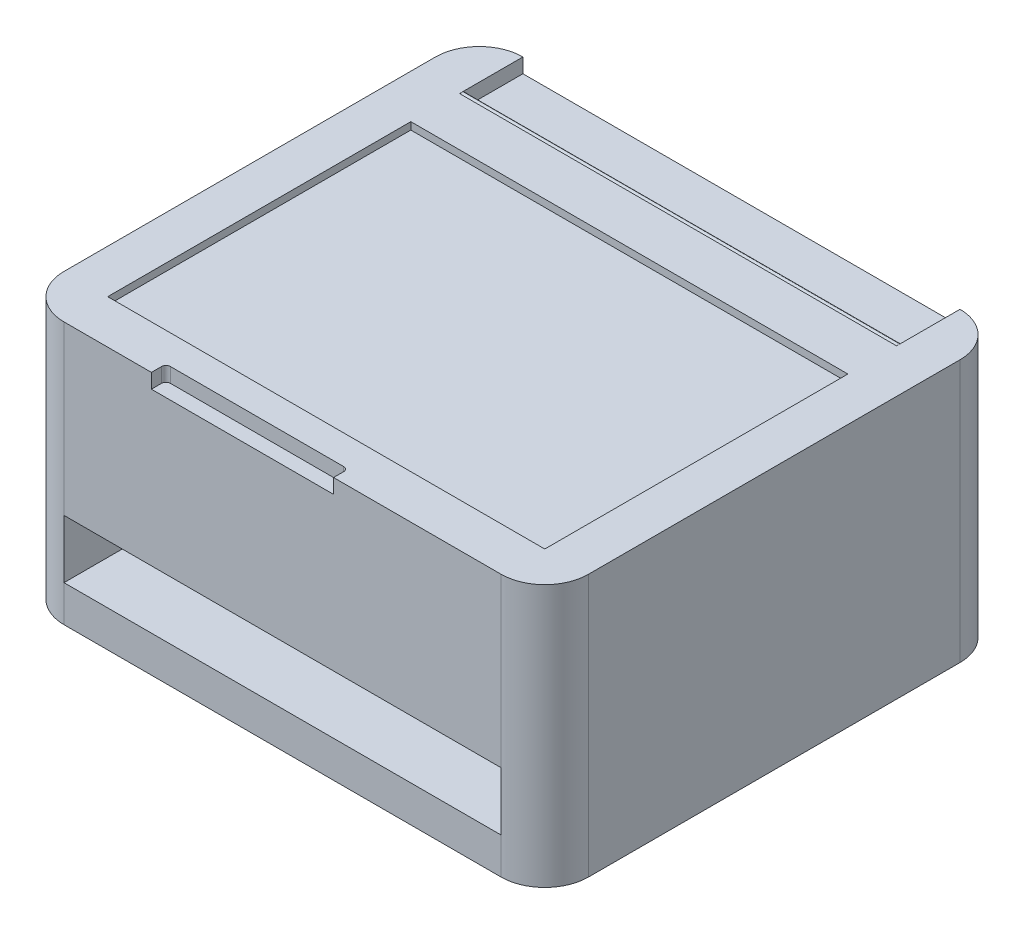
ISO-10303-21;
HEADER;
FILE_DESCRIPTION(('STEP AP214'),'2;1');
FILE_NAME('part.step','',(''),(''),'','','');
FILE_SCHEMA(('AUTOMOTIVE_DESIGN { 1 0 10303 214 1 1 1 1 }'));
ENDSEC;
DATA;
#1=APPLICATION_CONTEXT('core data for automotive mechanical design processes');
#2=APPLICATION_PROTOCOL_DEFINITION('international standard','automotive_design',2000,#1);
#3=PRODUCT_CONTEXT('',#1,'mechanical');
#4=PRODUCT('Part','Part','',(#3));
#5=PRODUCT_RELATED_PRODUCT_CATEGORY('part','',(#4));
#6=PRODUCT_DEFINITION_FORMATION('','',#4);
#7=PRODUCT_DEFINITION_CONTEXT('part definition',#1,'design');
#8=PRODUCT_DEFINITION('design','',#6,#7);
#9=PRODUCT_DEFINITION_SHAPE('','',#8);
#10=(LENGTH_UNIT() NAMED_UNIT(*) SI_UNIT(.MILLI.,.METRE.));
#11=(NAMED_UNIT(*) PLANE_ANGLE_UNIT() SI_UNIT($,.RADIAN.));
#12=(NAMED_UNIT(*) SI_UNIT($,.STERADIAN.) SOLID_ANGLE_UNIT());
#13=UNCERTAINTY_MEASURE_WITH_UNIT(LENGTH_MEASURE(1.E-05),#10,'distance_accuracy_value','');
#14=(GEOMETRIC_REPRESENTATION_CONTEXT(3) GLOBAL_UNCERTAINTY_ASSIGNED_CONTEXT((#13)) GLOBAL_UNIT_ASSIGNED_CONTEXT((#10,
#11,#12)) REPRESENTATION_CONTEXT('',''));
#15=CARTESIAN_POINT('',(0.,0.,0.));
#16=DIRECTION('',(0.,0.,1.));
#17=DIRECTION('',(1.,0.,0.));
#18=AXIS2_PLACEMENT_3D('',#15,#16,#17);
#19=CARTESIAN_POINT('',(150.,-1.76,-115.74));
#20=DIRECTION('',(-1.,0.,0.));
#21=DIRECTION('',(0.,0.,1.));
#22=AXIS2_PLACEMENT_3D('',#19,#20,#21);
#23=CYLINDRICAL_SURFACE('',#22,1.75999999999999);
#24=CARTESIAN_POINT('',(150.,-1.76,-115.74));
#25=DIRECTION('',(1.,0.,0.));
#26=DIRECTION('',(0.,0.,-1.));
#27=AXIS2_PLACEMENT_3D('',#24,#25,#26);
#28=CIRCLE('',#27,1.75999999999999);
#29=CARTESIAN_POINT('',(150.,-1.76,-117.5));
#30=VERTEX_POINT('',#29);
#31=EDGE_CURVE('E11',#30,#30,#28,.T.);
#32=ORIENTED_EDGE('',*,*,#31,.F.);
#33=EDGE_LOOP('',(#32));
#34=FACE_BOUND('',#33,.T.);
#35=CARTESIAN_POINT('',(-150.,-1.76,-115.74));
#36=DIRECTION('',(1.,0.,0.));
#37=DIRECTION('',(0.,0.,-1.));
#38=AXIS2_PLACEMENT_3D('',#35,#36,#37);
#39=CIRCLE('',#38,1.75999999999999);
#40=CARTESIAN_POINT('',(-150.,-1.76,-117.5));
#41=VERTEX_POINT('',#40);
#42=EDGE_CURVE('E53',#41,#41,#39,.T.);
#43=ORIENTED_EDGE('',*,*,#42,.T.);
#44=EDGE_LOOP('',(#43));
#45=FACE_BOUND('',#44,.T.);
#46=ADVANCED_FACE('F50',(#34,#45),#23,.T.);
#47=CARTESIAN_POINT('',(150.,-1.76,-115.74));
#48=DIRECTION('',(1.,0.,0.));
#49=DIRECTION('',(0.,0.,-1.));
#50=AXIS2_PLACEMENT_3D('',#47,#48,#49);
#51=PLANE('',#50);
#52=ORIENTED_EDGE('',*,*,#31,.T.);
#53=EDGE_LOOP('',(#52));
#54=FACE_BOUND('',#53,.T.);
#55=ADVANCED_FACE('F65',(#54),#51,.T.);
#56=CARTESIAN_POINT('',(-150.,-1.76,-115.74));
#57=DIRECTION('',(1.,0.,0.));
#58=DIRECTION('',(0.,0.,-1.));
#59=AXIS2_PLACEMENT_3D('',#56,#57,#58);
#60=PLANE('',#59);
#61=ORIENTED_EDGE('',*,*,#42,.F.);
#62=EDGE_LOOP('',(#61));
#63=FACE_BOUND('',#62,.T.);
#64=ADVANCED_FACE('F63',(#63),#60,.F.);
#65=CLOSED_SHELL('',(#46,#55,#64));
#66=MANIFOLD_SOLID_BREP('B2',#65);
#67=CARTESIAN_POINT('',(180.,-180.,157.5));
#68=DIRECTION('',(0.,0.,1.));
#69=DIRECTION('',(1.,0.,0.));
#70=AXIS2_PLACEMENT_3D('',#67,#68,#69);
#71=PLANE('',#70);
#72=DIRECTION('',(1.,0.,0.));
#73=VECTOR('',#72,1.);
#74=CARTESIAN_POINT('',(-150.,-155.,157.5));
#75=LINE('',#74,#73);
#76=CARTESIAN_POINT('',(-150.,-155.,157.5));
#77=VERTEX_POINT('',#76);
#78=CARTESIAN_POINT('',(150.,-155.,157.5));
#79=VERTEX_POINT('',#78);
#80=EDGE_CURVE('E113',#77,#79,#75,.T.);
#81=ORIENTED_EDGE('',*,*,#80,.F.);
#82=DIRECTION('',(0.,1.,0.));
#83=VECTOR('',#82,1.);
#84=CARTESIAN_POINT('',(-150.,-180.,157.5));
#85=LINE('',#84,#83);
#86=CARTESIAN_POINT('',(-150.,-180.,157.5));
#87=VERTEX_POINT('',#86);
#88=EDGE_CURVE('E465',#77,#87,#85,.F.);
#89=ORIENTED_EDGE('',*,*,#88,.T.);
#90=DIRECTION('',(1.,0.,0.));
#91=VECTOR('',#90,1.);
#92=CARTESIAN_POINT('',(180.,-180.,157.5));
#93=LINE('',#92,#91);
#94=CARTESIAN_POINT('',(150.,-180.,157.5));
#95=VERTEX_POINT('',#94);
#96=EDGE_CURVE('E429',#87,#95,#93,.T.);
#97=ORIENTED_EDGE('',*,*,#96,.T.);
#98=DIRECTION('',(0.,1.,0.));
#99=VECTOR('',#98,1.);
#100=CARTESIAN_POINT('',(150.,-180.,157.5));
#101=LINE('',#100,#99);
#102=EDGE_CURVE('E462',#95,#79,#101,.T.);
#103=ORIENTED_EDGE('',*,*,#102,.T.);
#104=EDGE_LOOP('',(#81,#89,#97,#103));
#105=FACE_BOUND('',#104,.T.);
#106=ADVANCED_FACE('F90',(#105),#71,.T.);
#107=CARTESIAN_POINT('',(-150.,-10.,-117.5));
#108=DIRECTION('',(0.,0.,1.));
#109=DIRECTION('',(1.,0.,0.));
#110=AXIS2_PLACEMENT_3D('',#107,#108,#109);
#111=PLANE('',#110);
#112=DIRECTION('',(-1.,0.,0.));
#113=VECTOR('',#112,1.);
#114=CARTESIAN_POINT('',(-150.,-3.52,-117.5));
#115=LINE('',#114,#113);
#116=CARTESIAN_POINT('',(150.,-3.52,-117.5));
#117=VERTEX_POINT('',#116);
#118=CARTESIAN_POINT('',(-150.,-3.52,-117.5));
#119=VERTEX_POINT('',#118);
#120=EDGE_CURVE('E346',#117,#119,#115,.T.);
#121=ORIENTED_EDGE('',*,*,#120,.F.);
#122=DIRECTION('',(0.,1.,0.));
#123=VECTOR('',#122,1.);
#124=CARTESIAN_POINT('',(150.,-10.,-117.5));
#125=LINE('',#124,#123);
#126=CARTESIAN_POINT('',(150.,-10.,-117.5));
#127=VERTEX_POINT('',#126);
#128=EDGE_CURVE('E418',#127,#117,#125,.T.);
#129=ORIENTED_EDGE('',*,*,#128,.F.);
#130=DIRECTION('',(1.,0.,0.));
#131=VECTOR('',#130,1.);
#132=CARTESIAN_POINT('',(-150.,-10.,-117.5));
#133=LINE('',#132,#131);
#134=CARTESIAN_POINT('',(-150.,-10.,-117.5));
#135=VERTEX_POINT('',#134);
#136=EDGE_CURVE('E409',#135,#127,#133,.T.);
#137=ORIENTED_EDGE('',*,*,#136,.F.);
#138=DIRECTION('',(0.,1.,0.));
#139=VECTOR('',#138,1.);
#140=CARTESIAN_POINT('',(-150.,-10.,-117.5));
#141=LINE('',#140,#139);
#142=EDGE_CURVE('E422',#135,#119,#141,.T.);
#143=ORIENTED_EDGE('',*,*,#142,.T.);
#144=EDGE_LOOP('',(#121,#129,#137,#143));
#145=FACE_BOUND('',#144,.T.);
#146=ADVANCED_FACE('F563',(#145),#111,.F.);
#147=CARTESIAN_POINT('',(180.,-180.,-157.5));
#148=DIRECTION('',(0.,0.,-1.));
#149=DIRECTION('',(-1.,0.,0.));
#150=AXIS2_PLACEMENT_3D('',#147,#148,#149);
#151=PLANE('',#150);
#152=DIRECTION('',(0.,1.,0.));
#153=VECTOR('',#152,1.);
#154=CARTESIAN_POINT('',(-150.,-180.,-157.5));
#155=LINE('',#154,#153);
#156=CARTESIAN_POINT('',(-150.,-180.,-157.5));
#157=VERTEX_POINT('',#156);
#158=CARTESIAN_POINT('',(-150.,-10.,-157.5));
#159=VERTEX_POINT('',#158);
#160=EDGE_CURVE('E480',#157,#159,#155,.T.);
#161=ORIENTED_EDGE('',*,*,#160,.T.);
#162=DIRECTION('',(-1.,0.,0.));
#163=VECTOR('',#162,1.);
#164=CARTESIAN_POINT('',(-150.,-10.,-157.5));
#165=LINE('',#164,#163);
#166=CARTESIAN_POINT('',(150.,-10.,-157.5));
#167=VERTEX_POINT('',#166);
#168=EDGE_CURVE('E402',#167,#159,#165,.T.);
#169=ORIENTED_EDGE('',*,*,#168,.F.);
#170=DIRECTION('',(0.,1.,0.));
#171=VECTOR('',#170,1.);
#172=CARTESIAN_POINT('',(150.,-180.,-157.5));
#173=LINE('',#172,#171);
#174=CARTESIAN_POINT('',(150.,-180.,-157.5));
#175=VERTEX_POINT('',#174);
#176=EDGE_CURVE('E477',#167,#175,#173,.F.);
#177=ORIENTED_EDGE('',*,*,#176,.T.);
#178=DIRECTION('',(-1.,0.,0.));
#179=VECTOR('',#178,1.);
#180=CARTESIAN_POINT('',(180.,-180.,-157.5));
#181=LINE('',#180,#179);
#182=EDGE_CURVE('E436',#175,#157,#181,.T.);
#183=ORIENTED_EDGE('',*,*,#182,.T.);
#184=EDGE_LOOP('',(#161,#169,#177,#183));
#185=FACE_BOUND('',#184,.T.);
#186=ADVANCED_FACE('F524',(#185),#151,.T.);
#187=CARTESIAN_POINT('',(-180.,-180.,157.5));
#188=DIRECTION('',(-1.,0.,0.));
#189=DIRECTION('',(0.,0.,1.));
#190=AXIS2_PLACEMENT_3D('',#187,#188,#189);
#191=PLANE('',#190);
#192=DIRECTION('',(0.,0.,1.));
#193=VECTOR('',#192,1.);
#194=CARTESIAN_POINT('',(-180.,-180.,157.5));
#195=LINE('',#194,#193);
#196=CARTESIAN_POINT('',(-180.,-180.,-127.5));
#197=VERTEX_POINT('',#196);
#198=CARTESIAN_POINT('',(-180.,-180.,127.5));
#199=VERTEX_POINT('',#198);
#200=EDGE_CURVE('E426',#197,#199,#195,.T.);
#201=ORIENTED_EDGE('',*,*,#200,.T.);
#202=DIRECTION('',(0.,1.,0.));
#203=VECTOR('',#202,1.);
#204=CARTESIAN_POINT('',(-180.,-180.,127.5));
#205=LINE('',#204,#203);
#206=CARTESIAN_POINT('',(-180.,0.,127.5));
#207=VERTEX_POINT('',#206);
#208=EDGE_CURVE('E449',#199,#207,#205,.T.);
#209=ORIENTED_EDGE('',*,*,#208,.T.);
#210=DIRECTION('',(0.,0.,1.));
#211=VECTOR('',#210,1.);
#212=CARTESIAN_POINT('',(-180.,0.,157.5));
#213=LINE('',#212,#211);
#214=CARTESIAN_POINT('',(-180.,0.,-127.5));
#215=VERTEX_POINT('',#214);
#216=EDGE_CURVE('E421',#215,#207,#213,.T.);
#217=ORIENTED_EDGE('',*,*,#216,.F.);
#218=DIRECTION('',(0.,1.,0.));
#219=VECTOR('',#218,1.);
#220=CARTESIAN_POINT('',(-180.,-180.,-127.5));
#221=LINE('',#220,#219);
#222=EDGE_CURVE('E439',#215,#197,#221,.F.);
#223=ORIENTED_EDGE('',*,*,#222,.T.);
#224=EDGE_LOOP('',(#201,#209,#217,#223));
#225=FACE_BOUND('',#224,.T.);
#226=ADVANCED_FACE('F510',(#225),#191,.T.);
#227=CARTESIAN_POINT('',(180.,-180.,157.5));
#228=DIRECTION('',(1.,0.,0.));
#229=DIRECTION('',(0.,0.,-1.));
#230=AXIS2_PLACEMENT_3D('',#227,#228,#229);
#231=PLANE('',#230);
#232=DIRECTION('',(0.,0.,-1.));
#233=VECTOR('',#232,1.);
#234=CARTESIAN_POINT('',(180.,-180.,157.5));
#235=LINE('',#234,#233);
#236=CARTESIAN_POINT('',(180.,-180.,127.5));
#237=VERTEX_POINT('',#236);
#238=CARTESIAN_POINT('',(180.,-180.,-127.5));
#239=VERTEX_POINT('',#238);
#240=EDGE_CURVE('E433',#237,#239,#235,.T.);
#241=ORIENTED_EDGE('',*,*,#240,.T.);
#242=DIRECTION('',(0.,1.,0.));
#243=VECTOR('',#242,1.);
#244=CARTESIAN_POINT('',(180.,-180.,-127.5));
#245=LINE('',#244,#243);
#246=CARTESIAN_POINT('',(180.,0.,-127.5));
#247=VERTEX_POINT('',#246);
#248=EDGE_CURVE('E48',#239,#247,#245,.T.);
#249=ORIENTED_EDGE('',*,*,#248,.T.);
#250=DIRECTION('',(0.,0.,-1.));
#251=VECTOR('',#250,1.);
#252=CARTESIAN_POINT('',(180.,0.,157.5));
#253=LINE('',#252,#251);
#254=CARTESIAN_POINT('',(180.,0.,127.5));
#255=VERTEX_POINT('',#254);
#256=EDGE_CURVE('E430',#255,#247,#253,.T.);
#257=ORIENTED_EDGE('',*,*,#256,.F.);
#258=DIRECTION('',(0.,1.,0.));
#259=VECTOR('',#258,1.);
#260=CARTESIAN_POINT('',(180.,-180.,127.5));
#261=LINE('',#260,#259);
#262=EDGE_CURVE('E98',#255,#237,#261,.F.);
#263=ORIENTED_EDGE('',*,*,#262,.T.);
#264=EDGE_LOOP('',(#241,#249,#257,#263));
#265=FACE_BOUND('',#264,.T.);
#266=ADVANCED_FACE('F486',(#265),#231,.T.);
#267=DIRECTION('',(-1.,0.,0.));
#268=VECTOR('',#267,1.);
#269=CARTESIAN_POINT('',(-150.,-115.,157.5));
#270=LINE('',#269,#268);
#271=CARTESIAN_POINT('',(150.,-115.,157.5));
#272=VERTEX_POINT('',#271);
#273=CARTESIAN_POINT('',(-150.,-115.,157.5));
#274=VERTEX_POINT('',#273);
#275=EDGE_CURVE('E325',#272,#274,#270,.T.);
#276=ORIENTED_EDGE('',*,*,#275,.F.);
#277=CARTESIAN_POINT('',(150.,0.,157.5));
#278=VERTEX_POINT('',#277);
#279=EDGE_CURVE('E461',#272,#278,#101,.T.);
#280=ORIENTED_EDGE('',*,*,#279,.T.);
#281=DIRECTION('',(1.,0.,0.));
#282=VECTOR('',#281,1.);
#283=CARTESIAN_POINT('',(180.,0.,157.5));
#284=LINE('',#283,#282);
#285=CARTESIAN_POINT('',(35.0000000000001,0.,157.5));
#286=VERTEX_POINT('',#285);
#287=EDGE_CURVE('E442',#286,#278,#284,.T.);
#288=ORIENTED_EDGE('',*,*,#287,.F.);
#289=DIRECTION('',(0.,1.,0.));
#290=VECTOR('',#289,1.);
#291=CARTESIAN_POINT('',(35.,-10.,157.5));
#292=LINE('',#291,#290);
#293=CARTESIAN_POINT('',(35.,-10.,157.5));
#294=VERTEX_POINT('',#293);
#295=EDGE_CURVE('E376',#294,#286,#292,.T.);
#296=ORIENTED_EDGE('',*,*,#295,.F.);
#297=DIRECTION('',(1.,0.,0.));
#298=VECTOR('',#297,1.);
#299=CARTESIAN_POINT('',(-90.,-10.,157.5));
#300=LINE('',#299,#298);
#301=CARTESIAN_POINT('',(-90.,-10.,157.5));
#302=VERTEX_POINT('',#301);
#303=EDGE_CURVE('E357',#302,#294,#300,.T.);
#304=ORIENTED_EDGE('',*,*,#303,.F.);
#305=DIRECTION('',(0.,1.,0.));
#306=VECTOR('',#305,1.);
#307=CARTESIAN_POINT('',(-90.,-10.,157.5));
#308=LINE('',#307,#306);
#309=CARTESIAN_POINT('',(-90.,0.,157.5));
#310=VERTEX_POINT('',#309);
#311=EDGE_CURVE('E389',#302,#310,#308,.T.);
#312=ORIENTED_EDGE('',*,*,#311,.T.);
#313=CARTESIAN_POINT('',(-150.,0.,157.5));
#314=VERTEX_POINT('',#313);
#315=EDGE_CURVE('E443',#314,#310,#284,.T.);
#316=ORIENTED_EDGE('',*,*,#315,.F.);
#317=EDGE_CURVE('E466',#314,#274,#85,.F.);
#318=ORIENTED_EDGE('',*,*,#317,.T.);
#319=EDGE_LOOP('',(#276,#280,#288,#296,#304,#312,#316,#318));
#320=FACE_BOUND('',#319,.T.);
#321=ADVANCED_FACE('F535',(#320),#71,.T.);
#322=CARTESIAN_POINT('',(0.,-180.,0.));
#323=DIRECTION('',(0.,1.,0.));
#324=DIRECTION('',(0.,0.,1.));
#325=AXIS2_PLACEMENT_3D('',#322,#323,#324);
#326=PLANE('',#325);
#327=ORIENTED_EDGE('',*,*,#96,.F.);
#328=CARTESIAN_POINT('',(-150.,-180.,127.5));
#329=DIRECTION('',(0.,1.,0.));
#330=DIRECTION('',(0.,0.,1.));
#331=AXIS2_PLACEMENT_3D('',#328,#329,#330);
#332=CIRCLE('',#331,30.);
#333=EDGE_CURVE('E475',#87,#199,#332,.F.);
#334=ORIENTED_EDGE('',*,*,#333,.T.);
#335=ORIENTED_EDGE('',*,*,#200,.F.);
#336=CARTESIAN_POINT('',(-150.,-180.,-127.5));
#337=DIRECTION('',(0.,1.,0.));
#338=DIRECTION('',(0.,0.,1.));
#339=AXIS2_PLACEMENT_3D('',#336,#337,#338);
#340=CIRCLE('',#339,30.);
#341=EDGE_CURVE('E473',#197,#157,#340,.F.);
#342=ORIENTED_EDGE('',*,*,#341,.T.);
#343=ORIENTED_EDGE('',*,*,#182,.F.);
#344=CARTESIAN_POINT('',(150.,-180.,-127.5));
#345=DIRECTION('',(0.,1.,0.));
#346=DIRECTION('',(0.,0.,1.));
#347=AXIS2_PLACEMENT_3D('',#344,#345,#346);
#348=CIRCLE('',#347,30.);
#349=EDGE_CURVE('E471',#175,#239,#348,.F.);
#350=ORIENTED_EDGE('',*,*,#349,.T.);
#351=ORIENTED_EDGE('',*,*,#240,.F.);
#352=CARTESIAN_POINT('',(150.,-180.,127.5));
#353=DIRECTION('',(0.,1.,0.));
#354=DIRECTION('',(0.,0.,1.));
#355=AXIS2_PLACEMENT_3D('',#352,#353,#354);
#356=CIRCLE('',#355,30.);
#357=EDGE_CURVE('E469',#237,#95,#356,.F.);
#358=ORIENTED_EDGE('',*,*,#357,.T.);
#359=EDGE_LOOP('',(#327,#334,#335,#342,#343,#350,#351,#358));
#360=FACE_BOUND('',#359,.T.);
#361=ADVANCED_FACE('F493',(#360),#326,.F.);
#362=CARTESIAN_POINT('',(0.,0.,0.));
#363=DIRECTION('',(0.,1.,0.));
#364=DIRECTION('',(0.,0.,1.));
#365=AXIS2_PLACEMENT_3D('',#362,#363,#364);
#366=PLANE('',#365);
#367=DIRECTION('',(-1.,0.,0.));
#368=VECTOR('',#367,1.);
#369=CARTESIAN_POINT('',(150.,0.,-80.5482054413467));
#370=LINE('',#369,#368);
#371=CARTESIAN_POINT('',(150.,0.,-80.5482054413467));
#372=VERTEX_POINT('',#371);
#373=CARTESIAN_POINT('',(-150.,0.,-80.5482054413467));
#374=VERTEX_POINT('',#373);
#375=EDGE_CURVE('E105',#372,#374,#370,.T.);
#376=ORIENTED_EDGE('',*,*,#375,.F.);
#377=DIRECTION('',(0.,0.,-1.));
#378=VECTOR('',#377,1.);
#379=CARTESIAN_POINT('',(150.,0.,127.5));
#380=LINE('',#379,#378);
#381=CARTESIAN_POINT('',(150.,0.,127.5));
#382=VERTEX_POINT('',#381);
#383=EDGE_CURVE('E289',#382,#372,#380,.T.);
#384=ORIENTED_EDGE('',*,*,#383,.F.);
#385=DIRECTION('',(1.,0.,0.));
#386=VECTOR('',#385,1.);
#387=CARTESIAN_POINT('',(-150.,0.,127.5));
#388=LINE('',#387,#386);
#389=CARTESIAN_POINT('',(-150.,0.,127.5));
#390=VERTEX_POINT('',#389);
#391=EDGE_CURVE('E292',#390,#382,#388,.T.);
#392=ORIENTED_EDGE('',*,*,#391,.F.);
#393=DIRECTION('',(0.,0.,1.));
#394=VECTOR('',#393,1.);
#395=CARTESIAN_POINT('',(-150.,0.,-80.5482054413467));
#396=LINE('',#395,#394);
#397=EDGE_CURVE('E298',#374,#390,#396,.T.);
#398=ORIENTED_EDGE('',*,*,#397,.F.);
#399=EDGE_LOOP('',(#376,#384,#392,#398));
#400=FACE_BOUND('',#399,.T.);
#401=DIRECTION('',(1.,0.,0.));
#402=VECTOR('',#401,1.);
#403=CARTESIAN_POINT('',(-150.,0.,-113.98));
#404=LINE('',#403,#402);
#405=CARTESIAN_POINT('',(-150.,0.,-113.98));
#406=VERTEX_POINT('',#405);
#407=CARTESIAN_POINT('',(150.,0.,-113.98));
#408=VERTEX_POINT('',#407);
#409=EDGE_CURVE('E332',#406,#408,#404,.T.);
#410=ORIENTED_EDGE('',*,*,#409,.F.);
#411=DIRECTION('',(0.,0.,1.));
#412=VECTOR('',#411,1.);
#413=CARTESIAN_POINT('',(-150.,0.,-157.5));
#414=LINE('',#413,#412);
#415=CARTESIAN_POINT('',(-150.,0.,-157.5));
#416=VERTEX_POINT('',#415);
#417=EDGE_CURVE('E392',#416,#406,#414,.T.);
#418=ORIENTED_EDGE('',*,*,#417,.F.);
#419=CARTESIAN_POINT('',(-150.,0.,-127.5));
#420=DIRECTION('',(0.,1.,0.));
#421=DIRECTION('',(0.,0.,1.));
#422=AXIS2_PLACEMENT_3D('',#419,#420,#421);
#423=CIRCLE('',#422,30.);
#424=EDGE_CURVE('E457',#416,#215,#423,.T.);
#425=ORIENTED_EDGE('',*,*,#424,.T.);
#426=ORIENTED_EDGE('',*,*,#216,.T.);
#427=CARTESIAN_POINT('',(-150.,0.,127.5));
#428=DIRECTION('',(0.,1.,0.));
#429=DIRECTION('',(0.,0.,1.));
#430=AXIS2_PLACEMENT_3D('',#427,#428,#429);
#431=CIRCLE('',#430,30.);
#432=EDGE_CURVE('E459',#207,#314,#431,.T.);
#433=ORIENTED_EDGE('',*,*,#432,.T.);
#434=ORIENTED_EDGE('',*,*,#315,.T.);
#435=DIRECTION('',(0.,0.,1.));
#436=VECTOR('',#435,1.);
#437=CARTESIAN_POINT('',(-90.,0.,157.5));
#438=LINE('',#437,#436);
#439=CARTESIAN_POINT('',(-90.,0.,150.5));
#440=VERTEX_POINT('',#439);
#441=EDGE_CURVE('E361',#440,#310,#438,.T.);
#442=ORIENTED_EDGE('',*,*,#441,.F.);
#443=CARTESIAN_POINT('',(-87.,0.,150.5));
#444=DIRECTION('',(0.,1.,0.));
#445=DIRECTION('',(0.,0.,-1.));
#446=AXIS2_PLACEMENT_3D('',#443,#444,#445);
#447=CIRCLE('',#446,3.);
#448=CARTESIAN_POINT('',(-87.,0.,147.5));
#449=VERTEX_POINT('',#448);
#450=EDGE_CURVE('E385',#449,#440,#447,.T.);
#451=ORIENTED_EDGE('',*,*,#450,.F.);
#452=DIRECTION('',(-1.,0.,0.));
#453=VECTOR('',#452,1.);
#454=CARTESIAN_POINT('',(-87.,0.,147.5));
#455=LINE('',#454,#453);
#456=CARTESIAN_POINT('',(32.,0.,147.5));
#457=VERTEX_POINT('',#456);
#458=EDGE_CURVE('E382',#457,#449,#455,.T.);
#459=ORIENTED_EDGE('',*,*,#458,.F.);
#460=CARTESIAN_POINT('',(32.,0.,150.5));
#461=DIRECTION('',(0.,1.,0.));
#462=DIRECTION('',(0.,0.,-1.));
#463=AXIS2_PLACEMENT_3D('',#460,#461,#462);
#464=CIRCLE('',#463,3.);
#465=CARTESIAN_POINT('',(35.,0.,150.5));
#466=VERTEX_POINT('',#465);
#467=EDGE_CURVE('E379',#466,#457,#464,.T.);
#468=ORIENTED_EDGE('',*,*,#467,.F.);
#469=DIRECTION('',(0.,0.,-1.));
#470=VECTOR('',#469,1.);
#471=CARTESIAN_POINT('',(35.,0.,150.5));
#472=LINE('',#471,#470);
#473=EDGE_CURVE('E354',#286,#466,#472,.T.);
#474=ORIENTED_EDGE('',*,*,#473,.F.);
#475=ORIENTED_EDGE('',*,*,#287,.T.);
#476=CARTESIAN_POINT('',(150.,0.,127.5));
#477=DIRECTION('',(0.,1.,0.));
#478=DIRECTION('',(0.,0.,1.));
#479=AXIS2_PLACEMENT_3D('',#476,#477,#478);
#480=CIRCLE('',#479,30.);
#481=EDGE_CURVE('E452',#278,#255,#480,.T.);
#482=ORIENTED_EDGE('',*,*,#481,.T.);
#483=ORIENTED_EDGE('',*,*,#256,.T.);
#484=CARTESIAN_POINT('',(150.,0.,-127.5));
#485=DIRECTION('',(0.,1.,0.));
#486=DIRECTION('',(0.,0.,1.));
#487=AXIS2_PLACEMENT_3D('',#484,#485,#486);
#488=CIRCLE('',#487,30.);
#489=CARTESIAN_POINT('',(150.,0.,-157.5));
#490=VERTEX_POINT('',#489);
#491=EDGE_CURVE('E454',#247,#490,#488,.T.);
#492=ORIENTED_EDGE('',*,*,#491,.T.);
#493=DIRECTION('',(0.,0.,-1.));
#494=VECTOR('',#493,1.);
#495=CARTESIAN_POINT('',(150.,0.,-117.5));
#496=LINE('',#495,#494);
#497=EDGE_CURVE('E406',#408,#490,#496,.T.);
#498=ORIENTED_EDGE('',*,*,#497,.F.);
#499=EDGE_LOOP('',(#410,#418,#425,#426,#433,#434,#442,#451,#459,#468,#474,#475,#482,#483,#492,#498));
#500=FACE_BOUND('',#499,.T.);
#501=ADVANCED_FACE('F514',(#400,#500),#366,.T.);
#502=CARTESIAN_POINT('',(-150.,-180.,127.5));
#503=DIRECTION('',(0.,1.,0.));
#504=DIRECTION('',(0.,0.,1.));
#505=AXIS2_PLACEMENT_3D('',#502,#503,#504);
#506=CYLINDRICAL_SURFACE('',#505,30.);
#507=ORIENTED_EDGE('',*,*,#333,.F.);
#508=ORIENTED_EDGE('',*,*,#88,.F.);
#509=DIRECTION('',(0.,-1.,0.));
#510=VECTOR('',#509,1.);
#511=CARTESIAN_POINT('',(-150.,-155.,157.5));
#512=LINE('',#511,#510);
#513=EDGE_CURVE('E311',#274,#77,#512,.T.);
#514=ORIENTED_EDGE('',*,*,#513,.F.);
#515=ORIENTED_EDGE('',*,*,#317,.F.);
#516=ORIENTED_EDGE('',*,*,#432,.F.);
#517=ORIENTED_EDGE('',*,*,#208,.F.);
#518=EDGE_LOOP('',(#507,#508,#514,#515,#516,#517));
#519=FACE_BOUND('',#518,.T.);
#520=ADVANCED_FACE('F505',(#519),#506,.T.);
#521=CARTESIAN_POINT('',(-150.,-180.,-127.5));
#522=DIRECTION('',(0.,1.,0.));
#523=DIRECTION('',(0.,0.,1.));
#524=AXIS2_PLACEMENT_3D('',#521,#522,#523);
#525=CYLINDRICAL_SURFACE('',#524,30.);
#526=ORIENTED_EDGE('',*,*,#341,.F.);
#527=ORIENTED_EDGE('',*,*,#222,.F.);
#528=ORIENTED_EDGE('',*,*,#424,.F.);
#529=DIRECTION('',(0.,1.,0.));
#530=VECTOR('',#529,1.);
#531=CARTESIAN_POINT('',(-150.,-10.,-157.5));
#532=LINE('',#531,#530);
#533=EDGE_CURVE('E415',#159,#416,#532,.T.);
#534=ORIENTED_EDGE('',*,*,#533,.F.);
#535=ORIENTED_EDGE('',*,*,#160,.F.);
#536=EDGE_LOOP('',(#526,#527,#528,#534,#535));
#537=FACE_BOUND('',#536,.T.);
#538=ADVANCED_FACE('F521',(#537),#525,.T.);
#539=CARTESIAN_POINT('',(150.,-180.,-127.5));
#540=DIRECTION('',(0.,1.,0.));
#541=DIRECTION('',(0.,0.,1.));
#542=AXIS2_PLACEMENT_3D('',#539,#540,#541);
#543=CYLINDRICAL_SURFACE('',#542,30.);
#544=ORIENTED_EDGE('',*,*,#349,.F.);
#545=ORIENTED_EDGE('',*,*,#176,.F.);
#546=EDGE_CURVE('E478',#490,#167,#173,.F.);
#547=ORIENTED_EDGE('',*,*,#546,.F.);
#548=ORIENTED_EDGE('',*,*,#491,.F.);
#549=ORIENTED_EDGE('',*,*,#248,.F.);
#550=EDGE_LOOP('',(#544,#545,#547,#548,#549));
#551=FACE_BOUND('',#550,.T.);
#552=ADVANCED_FACE('F529',(#551),#543,.T.);
#553=CARTESIAN_POINT('',(150.,-180.,127.5));
#554=DIRECTION('',(0.,1.,0.));
#555=DIRECTION('',(0.,0.,1.));
#556=AXIS2_PLACEMENT_3D('',#553,#554,#555);
#557=CYLINDRICAL_SURFACE('',#556,30.);
#558=ORIENTED_EDGE('',*,*,#357,.F.);
#559=ORIENTED_EDGE('',*,*,#262,.F.);
#560=ORIENTED_EDGE('',*,*,#481,.F.);
#561=ORIENTED_EDGE('',*,*,#279,.F.);
#562=DIRECTION('',(0.,1.,0.));
#563=VECTOR('',#562,1.);
#564=CARTESIAN_POINT('',(150.,-155.,157.5));
#565=LINE('',#564,#563);
#566=EDGE_CURVE('E322',#79,#272,#565,.T.);
#567=ORIENTED_EDGE('',*,*,#566,.F.);
#568=ORIENTED_EDGE('',*,*,#102,.F.);
#569=EDGE_LOOP('',(#558,#559,#560,#561,#567,#568));
#570=FACE_BOUND('',#569,.T.);
#571=ADVANCED_FACE('F92',(#570),#557,.T.);
#572=CARTESIAN_POINT('',(150.,-10.,-117.5));
#573=DIRECTION('',(1.,0.,0.));
#574=DIRECTION('',(0.,0.,-1.));
#575=AXIS2_PLACEMENT_3D('',#572,#573,#574);
#576=PLANE('',#575);
#577=ORIENTED_EDGE('',*,*,#497,.T.);
#578=ORIENTED_EDGE('',*,*,#546,.T.);
#579=DIRECTION('',(0.,0.,-1.));
#580=VECTOR('',#579,1.);
#581=CARTESIAN_POINT('',(150.,-10.,-117.5));
#582=LINE('',#581,#580);
#583=EDGE_CURVE('E412',#127,#167,#582,.T.);
#584=ORIENTED_EDGE('',*,*,#583,.F.);
#585=ORIENTED_EDGE('',*,*,#128,.T.);
#586=DIRECTION('',(0.,0.,-1.));
#587=VECTOR('',#586,1.);
#588=CARTESIAN_POINT('',(150.,-3.52,-117.5));
#589=LINE('',#588,#587);
#590=CARTESIAN_POINT('',(150.,-3.52,-113.98));
#591=VERTEX_POINT('',#590);
#592=EDGE_CURVE('E344',#591,#117,#589,.T.);
#593=ORIENTED_EDGE('',*,*,#592,.F.);
#594=DIRECTION('',(0.,1.,0.));
#595=VECTOR('',#594,1.);
#596=CARTESIAN_POINT('',(150.,-3.52,-113.98));
#597=LINE('',#596,#595);
#598=EDGE_CURVE('E351',#591,#408,#597,.T.);
#599=ORIENTED_EDGE('',*,*,#598,.T.);
#600=EDGE_LOOP('',(#577,#578,#584,#585,#593,#599));
#601=FACE_BOUND('',#600,.T.);
#602=ADVANCED_FACE('F590',(#601),#576,.F.);
#603=CARTESIAN_POINT('',(-150.,-10.,-157.5));
#604=DIRECTION('',(-1.,0.,0.));
#605=DIRECTION('',(0.,0.,1.));
#606=AXIS2_PLACEMENT_3D('',#603,#604,#605);
#607=PLANE('',#606);
#608=ORIENTED_EDGE('',*,*,#417,.T.);
#609=DIRECTION('',(0.,1.,0.));
#610=VECTOR('',#609,1.);
#611=CARTESIAN_POINT('',(-150.,-3.52,-113.98));
#612=LINE('',#611,#610);
#613=CARTESIAN_POINT('',(-150.,-3.52,-113.98));
#614=VERTEX_POINT('',#613);
#615=EDGE_CURVE('E348',#614,#406,#612,.T.);
#616=ORIENTED_EDGE('',*,*,#615,.F.);
#617=DIRECTION('',(0.,0.,1.));
#618=VECTOR('',#617,1.);
#619=CARTESIAN_POINT('',(-150.,-3.52,-117.5));
#620=LINE('',#619,#618);
#621=EDGE_CURVE('E338',#119,#614,#620,.T.);
#622=ORIENTED_EDGE('',*,*,#621,.F.);
#623=ORIENTED_EDGE('',*,*,#142,.F.);
#624=DIRECTION('',(0.,0.,1.));
#625=VECTOR('',#624,1.);
#626=CARTESIAN_POINT('',(-150.,-10.,-157.5));
#627=LINE('',#626,#625);
#628=EDGE_CURVE('E405',#159,#135,#627,.T.);
#629=ORIENTED_EDGE('',*,*,#628,.F.);
#630=ORIENTED_EDGE('',*,*,#533,.T.);
#631=EDGE_LOOP('',(#608,#616,#622,#623,#629,#630));
#632=FACE_BOUND('',#631,.T.);
#633=ADVANCED_FACE('F587',(#632),#607,.F.);
#634=CARTESIAN_POINT('',(0.,-10.,0.));
#635=DIRECTION('',(0.,1.,0.));
#636=DIRECTION('',(0.,0.,1.));
#637=AXIS2_PLACEMENT_3D('',#634,#635,#636);
#638=PLANE('',#637);
#639=ORIENTED_EDGE('',*,*,#168,.T.);
#640=ORIENTED_EDGE('',*,*,#628,.T.);
#641=ORIENTED_EDGE('',*,*,#136,.T.);
#642=ORIENTED_EDGE('',*,*,#583,.T.);
#643=EDGE_LOOP('',(#639,#640,#641,#642));
#644=FACE_BOUND('',#643,.T.);
#645=ADVANCED_FACE('F589',(#644),#638,.T.);
#646=CARTESIAN_POINT('',(-90.,-10.,157.5));
#647=DIRECTION('',(-1.,0.,0.));
#648=DIRECTION('',(0.,0.,1.));
#649=AXIS2_PLACEMENT_3D('',#646,#647,#648);
#650=PLANE('',#649);
#651=ORIENTED_EDGE('',*,*,#441,.T.);
#652=ORIENTED_EDGE('',*,*,#311,.F.);
#653=DIRECTION('',(0.,0.,1.));
#654=VECTOR('',#653,1.);
#655=CARTESIAN_POINT('',(-90.,-10.,157.5));
#656=LINE('',#655,#654);
#657=CARTESIAN_POINT('',(-90.,-10.,150.5));
#658=VERTEX_POINT('',#657);
#659=EDGE_CURVE('E373',#658,#302,#656,.T.);
#660=ORIENTED_EDGE('',*,*,#659,.F.);
#661=DIRECTION('',(0.,1.,0.));
#662=VECTOR('',#661,1.);
#663=CARTESIAN_POINT('',(-90.,-10.,150.5));
#664=LINE('',#663,#662);
#665=EDGE_CURVE('E393',#658,#440,#664,.T.);
#666=ORIENTED_EDGE('',*,*,#665,.T.);
#667=EDGE_LOOP('',(#651,#652,#660,#666));
#668=FACE_BOUND('',#667,.T.);
#669=ADVANCED_FACE('F598',(#668),#650,.F.);
#670=CARTESIAN_POINT('',(-87.,-10.,150.5));
#671=DIRECTION('',(0.,1.,0.));
#672=DIRECTION('',(0.,0.,1.));
#673=AXIS2_PLACEMENT_3D('',#670,#671,#672);
#674=CYLINDRICAL_SURFACE('',#673,3.);
#675=ORIENTED_EDGE('',*,*,#450,.T.);
#676=ORIENTED_EDGE('',*,*,#665,.F.);
#677=CARTESIAN_POINT('',(-87.,-10.,150.5));
#678=DIRECTION('',(0.,1.,0.));
#679=DIRECTION('',(0.,0.,-1.));
#680=AXIS2_PLACEMENT_3D('',#677,#678,#679);
#681=CIRCLE('',#680,3.);
#682=CARTESIAN_POINT('',(-87.,-10.,147.5));
#683=VERTEX_POINT('',#682);
#684=EDGE_CURVE('E370',#683,#658,#681,.T.);
#685=ORIENTED_EDGE('',*,*,#684,.F.);
#686=DIRECTION('',(0.,1.,0.));
#687=VECTOR('',#686,1.);
#688=CARTESIAN_POINT('',(-87.,-10.,147.5));
#689=LINE('',#688,#687);
#690=EDGE_CURVE('E395',#683,#449,#689,.T.);
#691=ORIENTED_EDGE('',*,*,#690,.T.);
#692=EDGE_LOOP('',(#675,#676,#685,#691));
#693=FACE_BOUND('',#692,.T.);
#694=ADVANCED_FACE('F612',(#693),#674,.F.);
#695=CARTESIAN_POINT('',(-87.,-10.,147.5));
#696=DIRECTION('',(0.,0.,-1.));
#697=DIRECTION('',(-1.,0.,0.));
#698=AXIS2_PLACEMENT_3D('',#695,#696,#697);
#699=PLANE('',#698);
#700=ORIENTED_EDGE('',*,*,#458,.T.);
#701=ORIENTED_EDGE('',*,*,#690,.F.);
#702=DIRECTION('',(-1.,0.,0.));
#703=VECTOR('',#702,1.);
#704=CARTESIAN_POINT('',(-87.,-10.,147.5));
#705=LINE('',#704,#703);
#706=CARTESIAN_POINT('',(32.,-10.,147.5));
#707=VERTEX_POINT('',#706);
#708=EDGE_CURVE('E367',#707,#683,#705,.T.);
#709=ORIENTED_EDGE('',*,*,#708,.F.);
#710=DIRECTION('',(0.,1.,0.));
#711=VECTOR('',#710,1.);
#712=CARTESIAN_POINT('',(32.,-10.,147.5));
#713=LINE('',#712,#711);
#714=EDGE_CURVE('E397',#707,#457,#713,.T.);
#715=ORIENTED_EDGE('',*,*,#714,.T.);
#716=EDGE_LOOP('',(#700,#701,#709,#715));
#717=FACE_BOUND('',#716,.T.);
#718=ADVANCED_FACE('F608',(#717),#699,.F.);
#719=CARTESIAN_POINT('',(32.,-10.,150.5));
#720=DIRECTION('',(0.,1.,0.));
#721=DIRECTION('',(0.,0.,1.));
#722=AXIS2_PLACEMENT_3D('',#719,#720,#721);
#723=CYLINDRICAL_SURFACE('',#722,3.);
#724=ORIENTED_EDGE('',*,*,#467,.T.);
#725=ORIENTED_EDGE('',*,*,#714,.F.);
#726=CARTESIAN_POINT('',(32.,-10.,150.5));
#727=DIRECTION('',(0.,1.,0.));
#728=DIRECTION('',(0.,0.,-1.));
#729=AXIS2_PLACEMENT_3D('',#726,#727,#728);
#730=CIRCLE('',#729,3.);
#731=CARTESIAN_POINT('',(35.,-10.,150.5));
#732=VERTEX_POINT('',#731);
#733=EDGE_CURVE('E364',#732,#707,#730,.T.);
#734=ORIENTED_EDGE('',*,*,#733,.F.);
#735=DIRECTION('',(0.,1.,0.));
#736=VECTOR('',#735,1.);
#737=CARTESIAN_POINT('',(35.,-10.,150.5));
#738=LINE('',#737,#736);
#739=EDGE_CURVE('E399',#732,#466,#738,.T.);
#740=ORIENTED_EDGE('',*,*,#739,.T.);
#741=EDGE_LOOP('',(#724,#725,#734,#740));
#742=FACE_BOUND('',#741,.T.);
#743=ADVANCED_FACE('F604',(#742),#723,.F.);
#744=CARTESIAN_POINT('',(35.,-10.,150.5));
#745=DIRECTION('',(1.,0.,0.));
#746=DIRECTION('',(0.,0.,-1.));
#747=AXIS2_PLACEMENT_3D('',#744,#745,#746);
#748=PLANE('',#747);
#749=ORIENTED_EDGE('',*,*,#473,.T.);
#750=ORIENTED_EDGE('',*,*,#739,.F.);
#751=DIRECTION('',(0.,0.,-1.));
#752=VECTOR('',#751,1.);
#753=CARTESIAN_POINT('',(35.,-10.,150.5));
#754=LINE('',#753,#752);
#755=EDGE_CURVE('E360',#294,#732,#754,.T.);
#756=ORIENTED_EDGE('',*,*,#755,.F.);
#757=ORIENTED_EDGE('',*,*,#295,.T.);
#758=EDGE_LOOP('',(#749,#750,#756,#757));
#759=FACE_BOUND('',#758,.T.);
#760=ADVANCED_FACE('F600',(#759),#748,.F.);
#761=CARTESIAN_POINT('',(32.,-10.,150.5));
#762=DIRECTION('',(0.,-1.,0.));
#763=DIRECTION('',(0.,0.,-1.));
#764=AXIS2_PLACEMENT_3D('',#761,#762,#763);
#765=PLANE('',#764);
#766=ORIENTED_EDGE('',*,*,#303,.T.);
#767=ORIENTED_EDGE('',*,*,#755,.T.);
#768=ORIENTED_EDGE('',*,*,#733,.T.);
#769=ORIENTED_EDGE('',*,*,#708,.T.);
#770=ORIENTED_EDGE('',*,*,#684,.T.);
#771=ORIENTED_EDGE('',*,*,#659,.T.);
#772=EDGE_LOOP('',(#766,#767,#768,#769,#770,#771));
#773=FACE_BOUND('',#772,.T.);
#774=ADVANCED_FACE('F603',(#773),#765,.F.);
#775=CARTESIAN_POINT('',(-150.,-3.52,-113.98));
#776=DIRECTION('',(0.,0.,1.));
#777=DIRECTION('',(1.,0.,0.));
#778=AXIS2_PLACEMENT_3D('',#775,#776,#777);
#779=PLANE('',#778);
#780=ORIENTED_EDGE('',*,*,#409,.T.);
#781=ORIENTED_EDGE('',*,*,#598,.F.);
#782=DIRECTION('',(1.,0.,0.));
#783=VECTOR('',#782,1.);
#784=CARTESIAN_POINT('',(-150.,-3.52,-113.98));
#785=LINE('',#784,#783);
#786=EDGE_CURVE('E341',#614,#591,#785,.T.);
#787=ORIENTED_EDGE('',*,*,#786,.F.);
#788=ORIENTED_EDGE('',*,*,#615,.T.);
#789=EDGE_LOOP('',(#780,#781,#787,#788));
#790=FACE_BOUND('',#789,.T.);
#791=ADVANCED_FACE('F558',(#790),#779,.F.);
#792=CARTESIAN_POINT('',(0.,-3.52,0.));
#793=DIRECTION('',(0.,1.,0.));
#794=DIRECTION('',(0.,0.,1.));
#795=AXIS2_PLACEMENT_3D('',#792,#793,#794);
#796=PLANE('',#795);
#797=ORIENTED_EDGE('',*,*,#621,.T.);
#798=ORIENTED_EDGE('',*,*,#786,.T.);
#799=ORIENTED_EDGE('',*,*,#592,.T.);
#800=ORIENTED_EDGE('',*,*,#120,.T.);
#801=EDGE_LOOP('',(#797,#798,#799,#800));
#802=FACE_BOUND('',#801,.T.);
#803=ADVANCED_FACE('F551',(#802),#796,.T.);
#804=CARTESIAN_POINT('',(-150.,-155.,7.50000000000001));
#805=DIRECTION('',(0.,-1.,0.));
#806=DIRECTION('',(0.,0.,-1.));
#807=AXIS2_PLACEMENT_3D('',#804,#805,#806);
#808=PLANE('',#807);
#809=ORIENTED_EDGE('',*,*,#80,.T.);
#810=DIRECTION('',(0.,0.,1.));
#811=VECTOR('',#810,1.);
#812=CARTESIAN_POINT('',(150.,-155.,7.50000000000001));
#813=LINE('',#812,#811);
#814=CARTESIAN_POINT('',(150.,-155.,7.50000000000001));
#815=VERTEX_POINT('',#814);
#816=EDGE_CURVE('E320',#815,#79,#813,.T.);
#817=ORIENTED_EDGE('',*,*,#816,.F.);
#818=DIRECTION('',(1.,0.,0.));
#819=VECTOR('',#818,1.);
#820=CARTESIAN_POINT('',(-150.,-155.,7.50000000000001));
#821=LINE('',#820,#819);
#822=CARTESIAN_POINT('',(-150.,-155.,7.50000000000001));
#823=VERTEX_POINT('',#822);
#824=EDGE_CURVE('E307',#823,#815,#821,.T.);
#825=ORIENTED_EDGE('',*,*,#824,.F.);
#826=DIRECTION('',(0.,0.,1.));
#827=VECTOR('',#826,1.);
#828=CARTESIAN_POINT('',(-150.,-155.,7.50000000000001));
#829=LINE('',#828,#827);
#830=EDGE_CURVE('E330',#823,#77,#829,.T.);
#831=ORIENTED_EDGE('',*,*,#830,.T.);
#832=EDGE_LOOP('',(#809,#817,#825,#831));
#833=FACE_BOUND('',#832,.T.);
#834=ADVANCED_FACE('F549',(#833),#808,.F.);
#835=CARTESIAN_POINT('',(-150.,-155.,7.50000000000001));
#836=DIRECTION('',(-1.,0.,0.));
#837=DIRECTION('',(0.,0.,1.));
#838=AXIS2_PLACEMENT_3D('',#835,#836,#837);
#839=PLANE('',#838);
#840=ORIENTED_EDGE('',*,*,#513,.T.);
#841=ORIENTED_EDGE('',*,*,#830,.F.);
#842=DIRECTION('',(0.,-1.,0.));
#843=VECTOR('',#842,1.);
#844=CARTESIAN_POINT('',(-150.,-155.,7.50000000000001));
#845=LINE('',#844,#843);
#846=CARTESIAN_POINT('',(-150.,-115.,7.50000000000001));
#847=VERTEX_POINT('',#846);
#848=EDGE_CURVE('E317',#847,#823,#845,.T.);
#849=ORIENTED_EDGE('',*,*,#848,.F.);
#850=DIRECTION('',(0.,0.,1.));
#851=VECTOR('',#850,1.);
#852=CARTESIAN_POINT('',(-150.,-115.,7.50000000000001));
#853=LINE('',#852,#851);
#854=EDGE_CURVE('E333',#847,#274,#853,.T.);
#855=ORIENTED_EDGE('',*,*,#854,.T.);
#856=EDGE_LOOP('',(#840,#841,#849,#855));
#857=FACE_BOUND('',#856,.T.);
#858=ADVANCED_FACE('F541',(#857),#839,.F.);
#859=CARTESIAN_POINT('',(-150.,-115.,7.50000000000001));
#860=DIRECTION('',(0.,1.,0.));
#861=DIRECTION('',(-1.,0.,0.));
#862=AXIS2_PLACEMENT_3D('',#859,#860,#861);
#863=PLANE('',#862);
#864=ORIENTED_EDGE('',*,*,#275,.T.);
#865=ORIENTED_EDGE('',*,*,#854,.F.);
#866=DIRECTION('',(-1.,0.,0.));
#867=VECTOR('',#866,1.);
#868=CARTESIAN_POINT('',(-150.,-115.,7.50000000000001));
#869=LINE('',#868,#867);
#870=CARTESIAN_POINT('',(150.,-115.,7.50000000000001));
#871=VERTEX_POINT('',#870);
#872=EDGE_CURVE('E314',#871,#847,#869,.T.);
#873=ORIENTED_EDGE('',*,*,#872,.F.);
#874=DIRECTION('',(0.,0.,1.));
#875=VECTOR('',#874,1.);
#876=CARTESIAN_POINT('',(150.,-115.,7.50000000000001));
#877=LINE('',#876,#875);
#878=EDGE_CURVE('E335',#871,#272,#877,.T.);
#879=ORIENTED_EDGE('',*,*,#878,.T.);
#880=EDGE_LOOP('',(#864,#865,#873,#879));
#881=FACE_BOUND('',#880,.T.);
#882=ADVANCED_FACE('F538',(#881),#863,.F.);
#883=CARTESIAN_POINT('',(150.,-155.,7.50000000000001));
#884=DIRECTION('',(1.,0.,0.));
#885=DIRECTION('',(0.,0.,-1.));
#886=AXIS2_PLACEMENT_3D('',#883,#884,#885);
#887=PLANE('',#886);
#888=ORIENTED_EDGE('',*,*,#566,.T.);
#889=ORIENTED_EDGE('',*,*,#878,.F.);
#890=DIRECTION('',(0.,1.,0.));
#891=VECTOR('',#890,1.);
#892=CARTESIAN_POINT('',(150.,-155.,7.50000000000001));
#893=LINE('',#892,#891);
#894=EDGE_CURVE('E310',#815,#871,#893,.T.);
#895=ORIENTED_EDGE('',*,*,#894,.F.);
#896=ORIENTED_EDGE('',*,*,#816,.T.);
#897=EDGE_LOOP('',(#888,#889,#895,#896));
#898=FACE_BOUND('',#897,.T.);
#899=ADVANCED_FACE('F548',(#898),#887,.F.);
#900=CARTESIAN_POINT('',(0.,0.,7.50000000000001));
#901=DIRECTION('',(0.,0.,1.));
#902=DIRECTION('',(1.,0.,0.));
#903=AXIS2_PLACEMENT_3D('',#900,#901,#902);
#904=PLANE('',#903);
#905=ORIENTED_EDGE('',*,*,#824,.T.);
#906=ORIENTED_EDGE('',*,*,#894,.T.);
#907=ORIENTED_EDGE('',*,*,#872,.T.);
#908=ORIENTED_EDGE('',*,*,#848,.T.);
#909=EDGE_LOOP('',(#905,#906,#907,#908));
#910=FACE_BOUND('',#909,.T.);
#911=ADVANCED_FACE('F545',(#910),#904,.T.);
#912=CARTESIAN_POINT('',(150.,-5.,-80.5482054413467));
#913=DIRECTION('',(0.,0.,-1.));
#914=DIRECTION('',(-1.,0.,0.));
#915=AXIS2_PLACEMENT_3D('',#912,#913,#914);
#916=PLANE('',#915);
#917=ORIENTED_EDGE('',*,*,#375,.T.);
#918=DIRECTION('',(0.,1.,0.));
#919=VECTOR('',#918,1.);
#920=CARTESIAN_POINT('',(-150.,-5.,-80.5482054413467));
#921=LINE('',#920,#919);
#922=CARTESIAN_POINT('',(-150.,-5.,-80.5482054413467));
#923=VERTEX_POINT('',#922);
#924=EDGE_CURVE('E267',#923,#374,#921,.T.);
#925=ORIENTED_EDGE('',*,*,#924,.F.);
#926=DIRECTION('',(-1.,0.,0.));
#927=VECTOR('',#926,1.);
#928=CARTESIAN_POINT('',(150.,-5.,-80.5482054413467));
#929=LINE('',#928,#927);
#930=CARTESIAN_POINT('',(150.,-5.,-80.5482054413467));
#931=VERTEX_POINT('',#930);
#932=EDGE_CURVE('E271',#931,#923,#929,.T.);
#933=ORIENTED_EDGE('',*,*,#932,.F.);
#934=DIRECTION('',(0.,1.,0.));
#935=VECTOR('',#934,1.);
#936=CARTESIAN_POINT('',(150.,-5.,-80.5482054413467));
#937=LINE('',#936,#935);
#938=EDGE_CURVE('E302',#931,#372,#937,.T.);
#939=ORIENTED_EDGE('',*,*,#938,.T.);
#940=EDGE_LOOP('',(#917,#925,#933,#939));
#941=FACE_BOUND('',#940,.T.);
#942=ADVANCED_FACE('F269',(#941),#916,.F.);
#943=CARTESIAN_POINT('',(150.,-5.,127.5));
#944=DIRECTION('',(1.,0.,0.));
#945=DIRECTION('',(0.,0.,-1.));
#946=AXIS2_PLACEMENT_3D('',#943,#944,#945);
#947=PLANE('',#946);
#948=ORIENTED_EDGE('',*,*,#383,.T.);
#949=ORIENTED_EDGE('',*,*,#938,.F.);
#950=DIRECTION('',(0.,0.,-1.));
#951=VECTOR('',#950,1.);
#952=CARTESIAN_POINT('',(150.,-5.,127.5));
#953=LINE('',#952,#951);
#954=CARTESIAN_POINT('',(150.,-5.,127.5));
#955=VERTEX_POINT('',#954);
#956=EDGE_CURVE('E277',#955,#931,#953,.T.);
#957=ORIENTED_EDGE('',*,*,#956,.F.);
#958=DIRECTION('',(0.,1.,0.));
#959=VECTOR('',#958,1.);
#960=CARTESIAN_POINT('',(150.,-5.,127.5));
#961=LINE('',#960,#959);
#962=EDGE_CURVE('E304',#955,#382,#961,.T.);
#963=ORIENTED_EDGE('',*,*,#962,.T.);
#964=EDGE_LOOP('',(#948,#949,#957,#963));
#965=FACE_BOUND('',#964,.T.);
#966=ADVANCED_FACE('F721',(#965),#947,.F.);
#967=CARTESIAN_POINT('',(-150.,-5.,127.5));
#968=DIRECTION('',(0.,0.,1.));
#969=DIRECTION('',(1.,0.,0.));
#970=AXIS2_PLACEMENT_3D('',#967,#968,#969);
#971=PLANE('',#970);
#972=ORIENTED_EDGE('',*,*,#391,.T.);
#973=ORIENTED_EDGE('',*,*,#962,.F.);
#974=DIRECTION('',(1.,0.,0.));
#975=VECTOR('',#974,1.);
#976=CARTESIAN_POINT('',(-150.,-5.,127.5));
#977=LINE('',#976,#975);
#978=CARTESIAN_POINT('',(-150.,-5.,127.5));
#979=VERTEX_POINT('',#978);
#980=EDGE_CURVE('E285',#979,#955,#977,.T.);
#981=ORIENTED_EDGE('',*,*,#980,.F.);
#982=DIRECTION('',(0.,1.,0.));
#983=VECTOR('',#982,1.);
#984=CARTESIAN_POINT('',(-150.,-5.,127.5));
#985=LINE('',#984,#983);
#986=EDGE_CURVE('E276',#979,#390,#985,.T.);
#987=ORIENTED_EDGE('',*,*,#986,.T.);
#988=EDGE_LOOP('',(#972,#973,#981,#987));
#989=FACE_BOUND('',#988,.T.);
#990=ADVANCED_FACE('F730',(#989),#971,.F.);
#991=CARTESIAN_POINT('',(-150.,-5.,-80.5482054413467));
#992=DIRECTION('',(-1.,0.,0.));
#993=DIRECTION('',(0.,0.,1.));
#994=AXIS2_PLACEMENT_3D('',#991,#992,#993);
#995=PLANE('',#994);
#996=ORIENTED_EDGE('',*,*,#397,.T.);
#997=ORIENTED_EDGE('',*,*,#986,.F.);
#998=DIRECTION('',(0.,0.,1.));
#999=VECTOR('',#998,1.);
#1000=CARTESIAN_POINT('',(-150.,-5.,-80.5482054413467));
#1001=LINE('',#1000,#999);
#1002=EDGE_CURVE('E280',#923,#979,#1001,.T.);
#1003=ORIENTED_EDGE('',*,*,#1002,.F.);
#1004=ORIENTED_EDGE('',*,*,#924,.T.);
#1005=EDGE_LOOP('',(#996,#997,#1003,#1004));
#1006=FACE_BOUND('',#1005,.T.);
#1007=ADVANCED_FACE('F281',(#1006),#995,.F.);
#1008=CARTESIAN_POINT('',(0.,-5.,0.));
#1009=DIRECTION('',(0.,1.,0.));
#1010=DIRECTION('',(0.,0.,1.));
#1011=AXIS2_PLACEMENT_3D('',#1008,#1009,#1010);
#1012=PLANE('',#1011);
#1013=ORIENTED_EDGE('',*,*,#932,.T.);
#1014=ORIENTED_EDGE('',*,*,#1002,.T.);
#1015=ORIENTED_EDGE('',*,*,#980,.T.);
#1016=ORIENTED_EDGE('',*,*,#956,.T.);
#1017=EDGE_LOOP('',(#1013,#1014,#1015,#1016));
#1018=FACE_BOUND('',#1017,.T.);
#1019=ADVANCED_FACE('F287',(#1018),#1012,.T.);
#1020=CLOSED_SHELL('',(#106,#146,#186,#226,#266,#321,#361,#501,#520,#538,#552,#571,#602,#633,
#645,#669,#694,#718,#743,#760,#774,#791,#803,#834,#858,#882,#899,#911,#942,#966,#990,#1007,#1019));
#1021=MANIFOLD_SOLID_BREP('B6',#1020);
#1022=ADVANCED_BREP_SHAPE_REPRESENTATION('',(#18,#66,#1021),#14);
#1023=SHAPE_DEFINITION_REPRESENTATION(#9,#1022);
ENDSEC;
END-ISO-10303-21;
